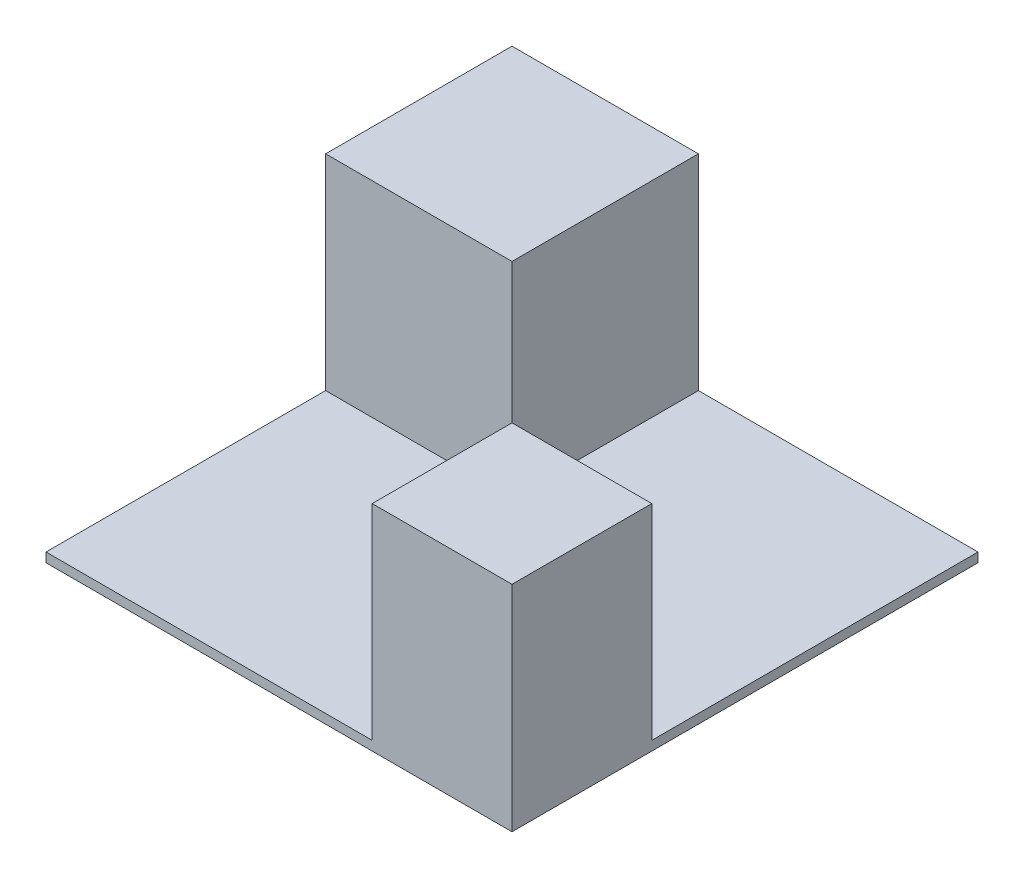
ISO-10303-21;
HEADER;
FILE_DESCRIPTION(('STEP AP214'),'2;1');
FILE_NAME('part.step','',(''),(''),'','','');
FILE_SCHEMA(('AUTOMOTIVE_DESIGN { 1 0 10303 214 1 1 1 1 }'));
ENDSEC;
DATA;
#1=APPLICATION_CONTEXT('core data for automotive mechanical design processes');
#2=APPLICATION_PROTOCOL_DEFINITION('international standard','automotive_design',2000,#1);
#3=PRODUCT_CONTEXT('',#1,'mechanical');
#4=PRODUCT('Part','Part','',(#3));
#5=PRODUCT_RELATED_PRODUCT_CATEGORY('part','',(#4));
#6=PRODUCT_DEFINITION_FORMATION('','',#4);
#7=PRODUCT_DEFINITION_CONTEXT('part definition',#1,'design');
#8=PRODUCT_DEFINITION('design','',#6,#7);
#9=PRODUCT_DEFINITION_SHAPE('','',#8);
#10=(LENGTH_UNIT() NAMED_UNIT(*) SI_UNIT(.MILLI.,.METRE.));
#11=(NAMED_UNIT(*) PLANE_ANGLE_UNIT() SI_UNIT($,.RADIAN.));
#12=(NAMED_UNIT(*) SI_UNIT($,.STERADIAN.) SOLID_ANGLE_UNIT());
#13=UNCERTAINTY_MEASURE_WITH_UNIT(LENGTH_MEASURE(1.E-05),#10,'distance_accuracy_value','');
#14=(GEOMETRIC_REPRESENTATION_CONTEXT(3) GLOBAL_UNCERTAINTY_ASSIGNED_CONTEXT((#13)) GLOBAL_UNIT_ASSIGNED_CONTEXT((#10,
#11,#12)) REPRESENTATION_CONTEXT('',''));
#15=CARTESIAN_POINT('',(0.,0.,0.));
#16=DIRECTION('',(0.,0.,1.));
#17=DIRECTION('',(1.,0.,0.));
#18=AXIS2_PLACEMENT_3D('',#15,#16,#17);
#19=CARTESIAN_POINT('',(0.,1.,0.));
#20=DIRECTION('',(0.,-1.,0.));
#21=DIRECTION('',(0.,0.,-1.));
#22=AXIS2_PLACEMENT_3D('',#19,#20,#21);
#23=PLANE('',#22);
#24=DIRECTION('',(-1.,0.,0.));
#25=VECTOR('',#24,1.);
#26=CARTESIAN_POINT('',(50.,1.,-15.));
#27=LINE('',#26,#25);
#28=CARTESIAN_POINT('',(50.,1.,-15.));
#29=VERTEX_POINT('',#28);
#30=CARTESIAN_POINT('',(35.,1.,-15.));
#31=VERTEX_POINT('',#30);
#32=EDGE_CURVE('E233',#29,#31,#27,.T.);
#33=ORIENTED_EDGE('',*,*,#32,.F.);
#34=DIRECTION('',(0.,0.,-1.));
#35=VECTOR('',#34,1.);
#36=CARTESIAN_POINT('',(50.,1.,0.));
#37=LINE('',#36,#35);
#38=CARTESIAN_POINT('',(50.,1.,-50.));
#39=VERTEX_POINT('',#38);
#40=EDGE_CURVE('E131',#29,#39,#37,.T.);
#41=ORIENTED_EDGE('',*,*,#40,.T.);
#42=DIRECTION('',(-1.,0.,0.));
#43=VECTOR('',#42,1.);
#44=CARTESIAN_POINT('',(0.,1.,-50.));
#45=LINE('',#44,#43);
#46=CARTESIAN_POINT('',(20.,1.,-50.));
#47=VERTEX_POINT('',#46);
#48=EDGE_CURVE('E168',#39,#47,#45,.T.);
#49=ORIENTED_EDGE('',*,*,#48,.T.);
#50=DIRECTION('',(0.,0.,-1.));
#51=VECTOR('',#50,1.);
#52=CARTESIAN_POINT('',(20.,1.,-50.));
#53=LINE('',#52,#51);
#54=CARTESIAN_POINT('',(20.,1.,-30.));
#55=VERTEX_POINT('',#54);
#56=EDGE_CURVE('E135',#55,#47,#53,.T.);
#57=ORIENTED_EDGE('',*,*,#56,.F.);
#58=DIRECTION('',(1.,0.,0.));
#59=VECTOR('',#58,1.);
#60=CARTESIAN_POINT('',(0.,1.,-30.));
#61=LINE('',#60,#59);
#62=CARTESIAN_POINT('',(0.,1.,-30.));
#63=VERTEX_POINT('',#62);
#64=EDGE_CURVE('E132',#63,#55,#61,.T.);
#65=ORIENTED_EDGE('',*,*,#64,.F.);
#66=DIRECTION('',(0.,0.,1.));
#67=VECTOR('',#66,1.);
#68=CARTESIAN_POINT('',(0.,1.,0.));
#69=LINE('',#68,#67);
#70=CARTESIAN_POINT('',(0.,1.,0.));
#71=VERTEX_POINT('',#70);
#72=EDGE_CURVE('E163',#63,#71,#69,.T.);
#73=ORIENTED_EDGE('',*,*,#72,.T.);
#74=DIRECTION('',(1.,0.,0.));
#75=VECTOR('',#74,1.);
#76=CARTESIAN_POINT('',(0.,1.,0.));
#77=LINE('',#76,#75);
#78=CARTESIAN_POINT('',(35.,1.,0.));
#79=VERTEX_POINT('',#78);
#80=EDGE_CURVE('E53',#71,#79,#77,.T.);
#81=ORIENTED_EDGE('',*,*,#80,.T.);
#82=DIRECTION('',(0.,0.,1.));
#83=VECTOR('',#82,1.);
#84=CARTESIAN_POINT('',(35.,1.,0.));
#85=LINE('',#84,#83);
#86=EDGE_CURVE('E48',#31,#79,#85,.T.);
#87=ORIENTED_EDGE('',*,*,#86,.F.);
#88=EDGE_LOOP('',(#33,#41,#49,#57,#65,#73,#81,#87));
#89=FACE_BOUND('',#88,.T.);
#90=ADVANCED_FACE('F33',(#89),#23,.F.);
#91=CARTESIAN_POINT('',(0.,1.,0.));
#92=DIRECTION('',(1.,0.,0.));
#93=DIRECTION('',(0.,0.,-1.));
#94=AXIS2_PLACEMENT_3D('',#91,#92,#93);
#95=PLANE('',#94);
#96=DIRECTION('',(0.,0.,1.));
#97=VECTOR('',#96,1.);
#98=CARTESIAN_POINT('',(0.,0.,0.));
#99=LINE('',#98,#97);
#100=CARTESIAN_POINT('',(0.,0.,-50.));
#101=VERTEX_POINT('',#100);
#102=CARTESIAN_POINT('',(0.,0.,0.));
#103=VERTEX_POINT('',#102);
#104=EDGE_CURVE('E162',#101,#103,#99,.T.);
#105=ORIENTED_EDGE('',*,*,#104,.T.);
#106=DIRECTION('',(0.,-1.,0.));
#107=VECTOR('',#106,1.);
#108=CARTESIAN_POINT('',(0.,1.,0.));
#109=LINE('',#108,#107);
#110=EDGE_CURVE('E11',#71,#103,#109,.T.);
#111=ORIENTED_EDGE('',*,*,#110,.F.);
#112=ORIENTED_EDGE('',*,*,#72,.F.);
#113=DIRECTION('',(0.,-1.,0.));
#114=VECTOR('',#113,1.);
#115=CARTESIAN_POINT('',(0.,23.,-30.));
#116=LINE('',#115,#114);
#117=CARTESIAN_POINT('',(0.,23.,-30.));
#118=VERTEX_POINT('',#117);
#119=EDGE_CURVE('E159',#118,#63,#116,.T.);
#120=ORIENTED_EDGE('',*,*,#119,.F.);
#121=DIRECTION('',(0.,0.,1.));
#122=VECTOR('',#121,1.);
#123=CARTESIAN_POINT('',(0.,23.,-50.));
#124=LINE('',#123,#122);
#125=CARTESIAN_POINT('',(0.,23.,-50.));
#126=VERTEX_POINT('',#125);
#127=EDGE_CURVE('E141',#126,#118,#124,.T.);
#128=ORIENTED_EDGE('',*,*,#127,.F.);
#129=DIRECTION('',(0.,-1.,0.));
#130=VECTOR('',#129,1.);
#131=CARTESIAN_POINT('',(0.,1.,-50.));
#132=LINE('',#131,#130);
#133=EDGE_CURVE('E170',#126,#101,#132,.T.);
#134=ORIENTED_EDGE('',*,*,#133,.T.);
#135=EDGE_LOOP('',(#105,#111,#112,#120,#128,#134));
#136=FACE_BOUND('',#135,.T.);
#137=ADVANCED_FACE('F35',(#136),#95,.F.);
#138=CARTESIAN_POINT('',(0.,1.,0.));
#139=DIRECTION('',(0.,0.,-1.));
#140=DIRECTION('',(-1.,0.,0.));
#141=AXIS2_PLACEMENT_3D('',#138,#139,#140);
#142=PLANE('',#141);
#143=DIRECTION('',(1.,0.,0.));
#144=VECTOR('',#143,1.);
#145=CARTESIAN_POINT('',(0.,0.,0.));
#146=LINE('',#145,#144);
#147=CARTESIAN_POINT('',(50.,0.,0.));
#148=VERTEX_POINT('',#147);
#149=EDGE_CURVE('E173',#103,#148,#146,.T.);
#150=ORIENTED_EDGE('',*,*,#149,.T.);
#151=DIRECTION('',(0.,-1.,0.));
#152=VECTOR('',#151,1.);
#153=CARTESIAN_POINT('',(50.,1.,0.));
#154=LINE('',#153,#152);
#155=CARTESIAN_POINT('',(50.,23.,0.));
#156=VERTEX_POINT('',#155);
#157=EDGE_CURVE('E41',#156,#148,#154,.T.);
#158=ORIENTED_EDGE('',*,*,#157,.F.);
#159=DIRECTION('',(1.,0.,0.));
#160=VECTOR('',#159,1.);
#161=CARTESIAN_POINT('',(50.,23.,0.));
#162=LINE('',#161,#160);
#163=CARTESIAN_POINT('',(35.,23.,0.));
#164=VERTEX_POINT('',#163);
#165=EDGE_CURVE('E125',#164,#156,#162,.T.);
#166=ORIENTED_EDGE('',*,*,#165,.F.);
#167=DIRECTION('',(0.,-1.,0.));
#168=VECTOR('',#167,1.);
#169=CARTESIAN_POINT('',(35.,23.,0.));
#170=LINE('',#169,#168);
#171=EDGE_CURVE('E137',#164,#79,#170,.T.);
#172=ORIENTED_EDGE('',*,*,#171,.T.);
#173=ORIENTED_EDGE('',*,*,#80,.F.);
#174=ORIENTED_EDGE('',*,*,#110,.T.);
#175=EDGE_LOOP('',(#150,#158,#166,#172,#173,#174));
#176=FACE_BOUND('',#175,.T.);
#177=ADVANCED_FACE('F219',(#176),#142,.F.);
#178=CARTESIAN_POINT('',(50.,1.,0.));
#179=DIRECTION('',(-1.,0.,0.));
#180=DIRECTION('',(0.,0.,1.));
#181=AXIS2_PLACEMENT_3D('',#178,#179,#180);
#182=PLANE('',#181);
#183=DIRECTION('',(0.,0.,-1.));
#184=VECTOR('',#183,1.);
#185=CARTESIAN_POINT('',(50.,0.,0.));
#186=LINE('',#185,#184);
#187=CARTESIAN_POINT('',(50.,0.,-50.));
#188=VERTEX_POINT('',#187);
#189=EDGE_CURVE('E175',#148,#188,#186,.T.);
#190=ORIENTED_EDGE('',*,*,#189,.T.);
#191=DIRECTION('',(0.,-1.,0.));
#192=VECTOR('',#191,1.);
#193=CARTESIAN_POINT('',(50.,1.,-50.));
#194=LINE('',#193,#192);
#195=EDGE_CURVE('E180',#39,#188,#194,.T.);
#196=ORIENTED_EDGE('',*,*,#195,.F.);
#197=ORIENTED_EDGE('',*,*,#40,.F.);
#198=DIRECTION('',(0.,-1.,0.));
#199=VECTOR('',#198,1.);
#200=CARTESIAN_POINT('',(50.,23.,-15.));
#201=LINE('',#200,#199);
#202=CARTESIAN_POINT('',(50.,23.,-15.));
#203=VERTEX_POINT('',#202);
#204=EDGE_CURVE('E113',#203,#29,#201,.T.);
#205=ORIENTED_EDGE('',*,*,#204,.F.);
#206=DIRECTION('',(0.,0.,-1.));
#207=VECTOR('',#206,1.);
#208=CARTESIAN_POINT('',(50.,23.,0.));
#209=LINE('',#208,#207);
#210=EDGE_CURVE('E119',#156,#203,#209,.T.);
#211=ORIENTED_EDGE('',*,*,#210,.F.);
#212=ORIENTED_EDGE('',*,*,#157,.T.);
#213=EDGE_LOOP('',(#190,#196,#197,#205,#211,#212));
#214=FACE_BOUND('',#213,.T.);
#215=ADVANCED_FACE('F129',(#214),#182,.F.);
#216=CARTESIAN_POINT('',(0.,1.,-50.));
#217=DIRECTION('',(0.,0.,1.));
#218=DIRECTION('',(1.,0.,0.));
#219=AXIS2_PLACEMENT_3D('',#216,#217,#218);
#220=PLANE('',#219);
#221=DIRECTION('',(-1.,0.,0.));
#222=VECTOR('',#221,1.);
#223=CARTESIAN_POINT('',(0.,0.,-50.));
#224=LINE('',#223,#222);
#225=EDGE_CURVE('E165',#188,#101,#224,.T.);
#226=ORIENTED_EDGE('',*,*,#225,.T.);
#227=ORIENTED_EDGE('',*,*,#133,.F.);
#228=DIRECTION('',(-1.,0.,0.));
#229=VECTOR('',#228,1.);
#230=CARTESIAN_POINT('',(0.,23.,-50.));
#231=LINE('',#230,#229);
#232=CARTESIAN_POINT('',(20.,23.,-50.));
#233=VERTEX_POINT('',#232);
#234=EDGE_CURVE('E148',#233,#126,#231,.T.);
#235=ORIENTED_EDGE('',*,*,#234,.F.);
#236=DIRECTION('',(0.,-1.,0.));
#237=VECTOR('',#236,1.);
#238=CARTESIAN_POINT('',(20.,23.,-50.));
#239=LINE('',#238,#237);
#240=EDGE_CURVE('E150',#233,#47,#239,.T.);
#241=ORIENTED_EDGE('',*,*,#240,.T.);
#242=ORIENTED_EDGE('',*,*,#48,.F.);
#243=ORIENTED_EDGE('',*,*,#195,.T.);
#244=EDGE_LOOP('',(#226,#227,#235,#241,#242,#243));
#245=FACE_BOUND('',#244,.T.);
#246=ADVANCED_FACE('F189',(#245),#220,.F.);
#247=CARTESIAN_POINT('',(0.,0.,0.));
#248=DIRECTION('',(0.,-1.,0.));
#249=DIRECTION('',(0.,0.,-1.));
#250=AXIS2_PLACEMENT_3D('',#247,#248,#249);
#251=PLANE('',#250);
#252=ORIENTED_EDGE('',*,*,#104,.F.);
#253=ORIENTED_EDGE('',*,*,#225,.F.);
#254=ORIENTED_EDGE('',*,*,#189,.F.);
#255=ORIENTED_EDGE('',*,*,#149,.F.);
#256=EDGE_LOOP('',(#252,#253,#254,#255));
#257=FACE_BOUND('',#256,.T.);
#258=ADVANCED_FACE('F187',(#257),#251,.T.);
#259=CARTESIAN_POINT('',(0.,23.,-30.));
#260=DIRECTION('',(0.,0.,-1.));
#261=DIRECTION('',(-1.,0.,0.));
#262=AXIS2_PLACEMENT_3D('',#259,#260,#261);
#263=PLANE('',#262);
#264=ORIENTED_EDGE('',*,*,#64,.T.);
#265=DIRECTION('',(0.,-1.,0.));
#266=VECTOR('',#265,1.);
#267=CARTESIAN_POINT('',(20.,23.,-30.));
#268=LINE('',#267,#266);
#269=CARTESIAN_POINT('',(20.,23.,-30.));
#270=VERTEX_POINT('',#269);
#271=EDGE_CURVE('E156',#270,#55,#268,.T.);
#272=ORIENTED_EDGE('',*,*,#271,.F.);
#273=DIRECTION('',(1.,0.,0.));
#274=VECTOR('',#273,1.);
#275=CARTESIAN_POINT('',(0.,23.,-30.));
#276=LINE('',#275,#274);
#277=EDGE_CURVE('E144',#118,#270,#276,.T.);
#278=ORIENTED_EDGE('',*,*,#277,.F.);
#279=ORIENTED_EDGE('',*,*,#119,.T.);
#280=EDGE_LOOP('',(#264,#272,#278,#279));
#281=FACE_BOUND('',#280,.T.);
#282=ADVANCED_FACE('F205',(#281),#263,.F.);
#283=CARTESIAN_POINT('',(20.,23.,-50.));
#284=DIRECTION('',(-1.,0.,0.));
#285=DIRECTION('',(0.,0.,1.));
#286=AXIS2_PLACEMENT_3D('',#283,#284,#285);
#287=PLANE('',#286);
#288=ORIENTED_EDGE('',*,*,#56,.T.);
#289=ORIENTED_EDGE('',*,*,#240,.F.);
#290=DIRECTION('',(0.,0.,-1.));
#291=VECTOR('',#290,1.);
#292=CARTESIAN_POINT('',(20.,23.,-50.));
#293=LINE('',#292,#291);
#294=EDGE_CURVE('E146',#270,#233,#293,.T.);
#295=ORIENTED_EDGE('',*,*,#294,.F.);
#296=ORIENTED_EDGE('',*,*,#271,.T.);
#297=EDGE_LOOP('',(#288,#289,#295,#296));
#298=FACE_BOUND('',#297,.T.);
#299=ADVANCED_FACE('F203',(#298),#287,.F.);
#300=CARTESIAN_POINT('',(0.,23.,0.));
#301=DIRECTION('',(0.,1.,0.));
#302=DIRECTION('',(0.,0.,1.));
#303=AXIS2_PLACEMENT_3D('',#300,#301,#302);
#304=PLANE('',#303);
#305=ORIENTED_EDGE('',*,*,#127,.T.);
#306=ORIENTED_EDGE('',*,*,#277,.T.);
#307=ORIENTED_EDGE('',*,*,#294,.T.);
#308=ORIENTED_EDGE('',*,*,#234,.T.);
#309=EDGE_LOOP('',(#305,#306,#307,#308));
#310=FACE_BOUND('',#309,.T.);
#311=ADVANCED_FACE('F198',(#310),#304,.T.);
#312=CARTESIAN_POINT('',(50.,23.,-15.));
#313=DIRECTION('',(0.,0.,1.));
#314=DIRECTION('',(1.,0.,0.));
#315=AXIS2_PLACEMENT_3D('',#312,#313,#314);
#316=PLANE('',#315);
#317=ORIENTED_EDGE('',*,*,#32,.T.);
#318=DIRECTION('',(0.,-1.,0.));
#319=VECTOR('',#318,1.);
#320=CARTESIAN_POINT('',(35.,23.,-15.));
#321=LINE('',#320,#319);
#322=CARTESIAN_POINT('',(35.,23.,-15.));
#323=VERTEX_POINT('',#322);
#324=EDGE_CURVE('E115',#323,#31,#321,.T.);
#325=ORIENTED_EDGE('',*,*,#324,.F.);
#326=DIRECTION('',(-1.,0.,0.));
#327=VECTOR('',#326,1.);
#328=CARTESIAN_POINT('',(50.,23.,-15.));
#329=LINE('',#328,#327);
#330=EDGE_CURVE('E109',#203,#323,#329,.T.);
#331=ORIENTED_EDGE('',*,*,#330,.F.);
#332=ORIENTED_EDGE('',*,*,#204,.T.);
#333=EDGE_LOOP('',(#317,#325,#331,#332));
#334=FACE_BOUND('',#333,.T.);
#335=ADVANCED_FACE('F111',(#334),#316,.F.);
#336=CARTESIAN_POINT('',(35.,23.,0.));
#337=DIRECTION('',(1.,0.,0.));
#338=DIRECTION('',(0.,0.,-1.));
#339=AXIS2_PLACEMENT_3D('',#336,#337,#338);
#340=PLANE('',#339);
#341=ORIENTED_EDGE('',*,*,#86,.T.);
#342=ORIENTED_EDGE('',*,*,#171,.F.);
#343=DIRECTION('',(0.,0.,1.));
#344=VECTOR('',#343,1.);
#345=CARTESIAN_POINT('',(35.,23.,0.));
#346=LINE('',#345,#344);
#347=EDGE_CURVE('E118',#323,#164,#346,.T.);
#348=ORIENTED_EDGE('',*,*,#347,.F.);
#349=ORIENTED_EDGE('',*,*,#324,.T.);
#350=EDGE_LOOP('',(#341,#342,#348,#349));
#351=FACE_BOUND('',#350,.T.);
#352=ADVANCED_FACE('F235',(#351),#340,.F.);
#353=CARTESIAN_POINT('',(0.,23.,0.));
#354=DIRECTION('',(0.,1.,0.));
#355=DIRECTION('',(0.,0.,1.));
#356=AXIS2_PLACEMENT_3D('',#353,#354,#355);
#357=PLANE('',#356);
#358=ORIENTED_EDGE('',*,*,#210,.T.);
#359=ORIENTED_EDGE('',*,*,#330,.T.);
#360=ORIENTED_EDGE('',*,*,#347,.T.);
#361=ORIENTED_EDGE('',*,*,#165,.T.);
#362=EDGE_LOOP('',(#358,#359,#360,#361));
#363=FACE_BOUND('',#362,.T.);
#364=ADVANCED_FACE('F123',(#363),#357,.T.);
#365=CLOSED_SHELL('',(#90,#137,#177,#215,#246,#258,#282,#299,#311,#335,#352,#364));
#366=MANIFOLD_SOLID_BREP('B2',#365);
#367=ADVANCED_BREP_SHAPE_REPRESENTATION('',(#18,#366),#14);
#368=SHAPE_DEFINITION_REPRESENTATION(#9,#367);
ENDSEC;
END-ISO-10303-21;
